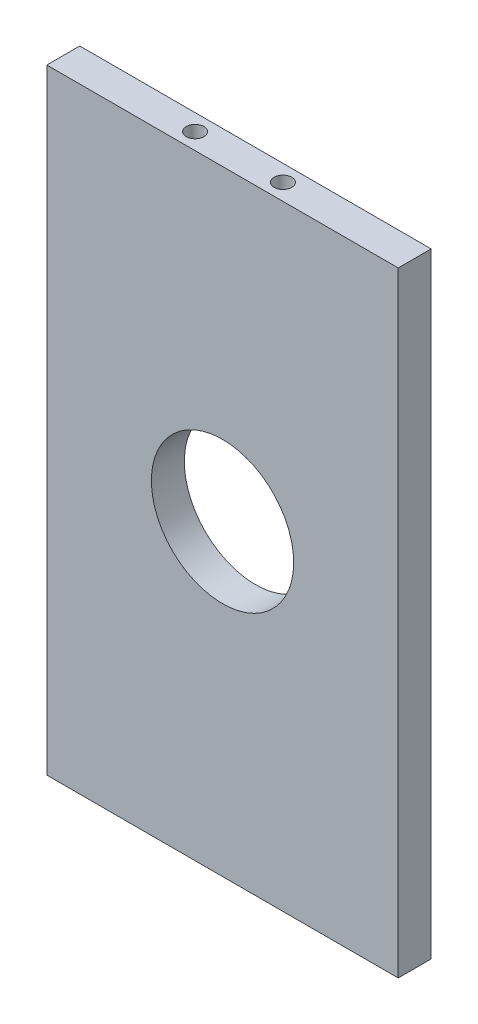
ISO-10303-21;
HEADER;
FILE_DESCRIPTION(('STEP AP214'),'2;1');
FILE_NAME('part.step','',(''),(''),'','','');
FILE_SCHEMA(('AUTOMOTIVE_DESIGN { 1 0 10303 214 1 1 1 1 }'));
ENDSEC;
DATA;
#1=APPLICATION_CONTEXT('core data for automotive mechanical design processes');
#2=APPLICATION_PROTOCOL_DEFINITION('international standard','automotive_design',2000,#1);
#3=PRODUCT_CONTEXT('',#1,'mechanical');
#4=PRODUCT('Part','Part','',(#3));
#5=PRODUCT_RELATED_PRODUCT_CATEGORY('part','',(#4));
#6=PRODUCT_DEFINITION_FORMATION('','',#4);
#7=PRODUCT_DEFINITION_CONTEXT('part definition',#1,'design');
#8=PRODUCT_DEFINITION('design','',#6,#7);
#9=PRODUCT_DEFINITION_SHAPE('','',#8);
#10=(LENGTH_UNIT() NAMED_UNIT(*) SI_UNIT(.MILLI.,.METRE.));
#11=(NAMED_UNIT(*) PLANE_ANGLE_UNIT() SI_UNIT($,.RADIAN.));
#12=(NAMED_UNIT(*) SI_UNIT($,.STERADIAN.) SOLID_ANGLE_UNIT());
#13=UNCERTAINTY_MEASURE_WITH_UNIT(LENGTH_MEASURE(1.E-05),#10,'distance_accuracy_value','');
#14=(GEOMETRIC_REPRESENTATION_CONTEXT(3) GLOBAL_UNCERTAINTY_ASSIGNED_CONTEXT((#13)) GLOBAL_UNIT_ASSIGNED_CONTEXT((#10,
#11,#12)) REPRESENTATION_CONTEXT('',''));
#15=CARTESIAN_POINT('',(0.,0.,0.));
#16=DIRECTION('',(0.,0.,1.));
#17=DIRECTION('',(1.,0.,0.));
#18=AXIS2_PLACEMENT_3D('',#15,#16,#17);
#19=CARTESIAN_POINT('',(0.,0.,9.525));
#20=DIRECTION('',(0.,0.,1.));
#21=DIRECTION('',(1.,0.,0.));
#22=AXIS2_PLACEMENT_3D('',#19,#20,#21);
#23=PLANE('',#22);
#24=DIRECTION('',(0.,1.,0.));
#25=VECTOR('',#24,1.);
#26=CARTESIAN_POINT('',(-50.8,88.9,9.525));
#27=LINE('',#26,#25);
#28=CARTESIAN_POINT('',(-50.8,-88.9,9.525));
#29=VERTEX_POINT('',#28);
#30=CARTESIAN_POINT('',(-50.8,88.9,9.525));
#31=VERTEX_POINT('',#30);
#32=EDGE_CURVE('E93',#29,#31,#27,.T.);
#33=ORIENTED_EDGE('',*,*,#32,.F.);
#34=DIRECTION('',(-1.,0.,0.));
#35=VECTOR('',#34,1.);
#36=CARTESIAN_POINT('',(-101.6,-88.9,9.525));
#37=LINE('',#36,#35);
#38=CARTESIAN_POINT('',(50.8,-88.9,9.525));
#39=VERTEX_POINT('',#38);
#40=EDGE_CURVE('E105',#39,#29,#37,.T.);
#41=ORIENTED_EDGE('',*,*,#40,.F.);
#42=DIRECTION('',(0.,-1.,0.));
#43=VECTOR('',#42,1.);
#44=CARTESIAN_POINT('',(50.8,88.9,9.525));
#45=LINE('',#44,#43);
#46=CARTESIAN_POINT('',(50.8,88.9,9.525));
#47=VERTEX_POINT('',#46);
#48=EDGE_CURVE('E55',#47,#39,#45,.T.);
#49=ORIENTED_EDGE('',*,*,#48,.F.);
#50=DIRECTION('',(1.,0.,0.));
#51=VECTOR('',#50,1.);
#52=CARTESIAN_POINT('',(-101.6,88.9,9.525));
#53=LINE('',#52,#51);
#54=EDGE_CURVE('E107',#31,#47,#53,.T.);
#55=ORIENTED_EDGE('',*,*,#54,.F.);
#56=EDGE_LOOP('',(#33,#41,#49,#55));
#57=FACE_BOUND('',#56,.T.);
#58=CARTESIAN_POINT('',(0.,0.,9.525));
#59=DIRECTION('',(0.,0.,1.));
#60=DIRECTION('',(1.,0.,0.));
#61=AXIS2_PLACEMENT_3D('',#58,#59,#60);
#62=CIRCLE('',#61,20.574);
#63=CARTESIAN_POINT('',(20.574,0.,9.525));
#64=VERTEX_POINT('',#63);
#65=EDGE_CURVE('E48',#64,#64,#62,.T.);
#66=ORIENTED_EDGE('',*,*,#65,.F.);
#67=EDGE_LOOP('',(#66));
#68=FACE_BOUND('',#67,.T.);
#69=ADVANCED_FACE('F40',(#57,#68),#23,.T.);
#70=CARTESIAN_POINT('',(0.,0.,0.));
#71=DIRECTION('',(0.,0.,1.));
#72=DIRECTION('',(1.,0.,0.));
#73=AXIS2_PLACEMENT_3D('',#70,#71,#72);
#74=PLANE('',#73);
#75=CARTESIAN_POINT('',(0.,0.,0.));
#76=DIRECTION('',(0.,0.,1.));
#77=DIRECTION('',(1.,0.,0.));
#78=AXIS2_PLACEMENT_3D('',#75,#76,#77);
#79=CIRCLE('',#78,20.574);
#80=CARTESIAN_POINT('',(20.574,0.,0.));
#81=VERTEX_POINT('',#80);
#82=EDGE_CURVE('E11',#81,#81,#79,.F.);
#83=ORIENTED_EDGE('',*,*,#82,.F.);
#84=EDGE_LOOP('',(#83));
#85=FACE_BOUND('',#84,.T.);
#86=DIRECTION('',(1.,0.,0.));
#87=VECTOR('',#86,1.);
#88=CARTESIAN_POINT('',(-101.6,-88.9,0.));
#89=LINE('',#88,#87);
#90=CARTESIAN_POINT('',(-50.8,-88.9,0.));
#91=VERTEX_POINT('',#90);
#92=CARTESIAN_POINT('',(50.8,-88.9,0.));
#93=VERTEX_POINT('',#92);
#94=EDGE_CURVE('E111',#91,#93,#89,.T.);
#95=ORIENTED_EDGE('',*,*,#94,.F.);
#96=DIRECTION('',(0.,-1.,0.));
#97=VECTOR('',#96,1.);
#98=CARTESIAN_POINT('',(-50.8,88.9,0.));
#99=LINE('',#98,#97);
#100=CARTESIAN_POINT('',(-50.8,88.9,0.));
#101=VERTEX_POINT('',#100);
#102=EDGE_CURVE('E63',#101,#91,#99,.T.);
#103=ORIENTED_EDGE('',*,*,#102,.F.);
#104=DIRECTION('',(-1.,0.,0.));
#105=VECTOR('',#104,1.);
#106=CARTESIAN_POINT('',(-101.6,88.9,0.));
#107=LINE('',#106,#105);
#108=CARTESIAN_POINT('',(50.8,88.9,0.));
#109=VERTEX_POINT('',#108);
#110=EDGE_CURVE('E114',#109,#101,#107,.T.);
#111=ORIENTED_EDGE('',*,*,#110,.F.);
#112=DIRECTION('',(0.,1.,0.));
#113=VECTOR('',#112,1.);
#114=CARTESIAN_POINT('',(50.8,88.9,0.));
#115=LINE('',#114,#113);
#116=EDGE_CURVE('E128',#93,#109,#115,.T.);
#117=ORIENTED_EDGE('',*,*,#116,.F.);
#118=EDGE_LOOP('',(#95,#103,#111,#117));
#119=FACE_BOUND('',#118,.T.);
#120=ADVANCED_FACE('F42',(#85,#119),#74,.F.);
#121=CARTESIAN_POINT('',(0.,0.,-0.000999999999999265));
#122=DIRECTION('',(0.,0.,1.));
#123=DIRECTION('',(1.,0.,0.));
#124=AXIS2_PLACEMENT_3D('',#121,#122,#123);
#125=CYLINDRICAL_SURFACE('',#124,20.574);
#126=ORIENTED_EDGE('',*,*,#65,.T.);
#127=EDGE_LOOP('',(#126));
#128=FACE_BOUND('',#127,.T.);
#129=ORIENTED_EDGE('',*,*,#82,.T.);
#130=EDGE_LOOP('',(#129));
#131=FACE_BOUND('',#130,.T.);
#132=ADVANCED_FACE('F169',(#128,#131),#125,.F.);
#133=CARTESIAN_POINT('',(-101.6,88.9,-0.000999999999999265));
#134=DIRECTION('',(0.,-1.,0.));
#135=DIRECTION('',(1.,0.,0.));
#136=AXIS2_PLACEMENT_3D('',#133,#134,#135);
#137=PLANE('',#136);
#138=CARTESIAN_POINT('',(-12.7,88.9,4.7625));
#139=DIRECTION('',(0.,1.,0.));
#140=DIRECTION('',(0.,0.,1.));
#141=AXIS2_PLACEMENT_3D('',#138,#139,#140);
#142=CIRCLE('',#141,2.55269999999999);
#143=CARTESIAN_POINT('',(-12.7,88.9,7.31519999999999));
#144=VERTEX_POINT('',#143);
#145=EDGE_CURVE('E148',#144,#144,#142,.T.);
#146=ORIENTED_EDGE('',*,*,#145,.F.);
#147=EDGE_LOOP('',(#146));
#148=FACE_BOUND('',#147,.T.);
#149=CARTESIAN_POINT('',(12.7,88.9,4.7625));
#150=DIRECTION('',(0.,1.,0.));
#151=DIRECTION('',(0.,0.,1.));
#152=AXIS2_PLACEMENT_3D('',#149,#150,#151);
#153=CIRCLE('',#152,2.55269999999999);
#154=CARTESIAN_POINT('',(12.7,88.9,7.31519999999999));
#155=VERTEX_POINT('',#154);
#156=EDGE_CURVE('E154',#155,#155,#153,.T.);
#157=ORIENTED_EDGE('',*,*,#156,.F.);
#158=EDGE_LOOP('',(#157));
#159=FACE_BOUND('',#158,.T.);
#160=ORIENTED_EDGE('',*,*,#110,.T.);
#161=DIRECTION('',(0.,0.,1.));
#162=VECTOR('',#161,1.);
#163=CARTESIAN_POINT('',(-50.8,88.9,-0.000999999999999265));
#164=LINE('',#163,#162);
#165=EDGE_CURVE('E99',#101,#31,#164,.T.);
#166=ORIENTED_EDGE('',*,*,#165,.T.);
#167=ORIENTED_EDGE('',*,*,#54,.T.);
#168=DIRECTION('',(0.,0.,1.));
#169=VECTOR('',#168,1.);
#170=CARTESIAN_POINT('',(50.8,88.9,-0.000999999999999265));
#171=LINE('',#170,#169);
#172=EDGE_CURVE('E125',#109,#47,#171,.T.);
#173=ORIENTED_EDGE('',*,*,#172,.F.);
#174=EDGE_LOOP('',(#160,#166,#167,#173));
#175=FACE_BOUND('',#174,.T.);
#176=ADVANCED_FACE('F124',(#148,#159,#175),#137,.F.);
#177=CARTESIAN_POINT('',(-101.6,-88.9,-0.000999999999999265));
#178=DIRECTION('',(0.,1.,0.));
#179=DIRECTION('',(0.,0.,1.));
#180=AXIS2_PLACEMENT_3D('',#177,#178,#179);
#181=PLANE('',#180);
#182=CARTESIAN_POINT('',(-12.7,-88.9,4.7625));
#183=DIRECTION('',(0.,-1.,0.));
#184=DIRECTION('',(0.,0.,-1.));
#185=AXIS2_PLACEMENT_3D('',#182,#183,#184);
#186=CIRCLE('',#185,2.55269999999999);
#187=CARTESIAN_POINT('',(-12.7,-88.9,2.20980000000001));
#188=VERTEX_POINT('',#187);
#189=EDGE_CURVE('E132',#188,#188,#186,.T.);
#190=ORIENTED_EDGE('',*,*,#189,.F.);
#191=EDGE_LOOP('',(#190));
#192=FACE_BOUND('',#191,.T.);
#193=CARTESIAN_POINT('',(12.7,-88.9,4.7625));
#194=DIRECTION('',(0.,-1.,0.));
#195=DIRECTION('',(0.,0.,-1.));
#196=AXIS2_PLACEMENT_3D('',#193,#194,#195);
#197=CIRCLE('',#196,2.55269999999999);
#198=CARTESIAN_POINT('',(12.7,-88.9,2.20980000000001));
#199=VERTEX_POINT('',#198);
#200=EDGE_CURVE('E142',#199,#199,#197,.T.);
#201=ORIENTED_EDGE('',*,*,#200,.F.);
#202=EDGE_LOOP('',(#201));
#203=FACE_BOUND('',#202,.T.);
#204=ORIENTED_EDGE('',*,*,#40,.T.);
#205=DIRECTION('',(0.,0.,1.));
#206=VECTOR('',#205,1.);
#207=CARTESIAN_POINT('',(-50.8,-88.9,-0.000999999999999265));
#208=LINE('',#207,#206);
#209=EDGE_CURVE('E90',#91,#29,#208,.T.);
#210=ORIENTED_EDGE('',*,*,#209,.F.);
#211=ORIENTED_EDGE('',*,*,#94,.T.);
#212=DIRECTION('',(0.,0.,1.));
#213=VECTOR('',#212,1.);
#214=CARTESIAN_POINT('',(50.8,-88.9,-0.000999999999999265));
#215=LINE('',#214,#213);
#216=EDGE_CURVE('E110',#93,#39,#215,.T.);
#217=ORIENTED_EDGE('',*,*,#216,.T.);
#218=EDGE_LOOP('',(#204,#210,#211,#217));
#219=FACE_BOUND('',#218,.T.);
#220=ADVANCED_FACE('F109',(#192,#203,#219),#181,.F.);
#221=CARTESIAN_POINT('',(12.7,69.85,4.7625));
#222=DIRECTION('',(0.,1.,0.));
#223=DIRECTION('',(0.,0.,1.));
#224=AXIS2_PLACEMENT_3D('',#221,#222,#223);
#225=CONICAL_SURFACE('',#224,2.5527,1.02974425867665);
#226=CARTESIAN_POINT('',(12.7,68.3161830978083,4.7625));
#227=VERTEX_POINT('',#226);
#228=VERTEX_LOOP('',#227);
#229=FACE_BOUND('',#228,.T.);
#230=CARTESIAN_POINT('',(12.7,69.85,4.7625));
#231=DIRECTION('',(0.,1.,0.));
#232=DIRECTION('',(0.,0.,1.));
#233=AXIS2_PLACEMENT_3D('',#230,#231,#232);
#234=CIRCLE('',#233,2.5527);
#235=CARTESIAN_POINT('',(12.7,69.85,7.3152));
#236=VERTEX_POINT('',#235);
#237=EDGE_CURVE('E119',#236,#236,#234,.T.);
#238=ORIENTED_EDGE('',*,*,#237,.T.);
#239=EDGE_LOOP('',(#238));
#240=FACE_BOUND('',#239,.T.);
#241=ADVANCED_FACE('F159',(#229,#240),#225,.F.);
#242=CARTESIAN_POINT('',(12.7,88.9,4.7625));
#243=DIRECTION('',(0.,1.,0.));
#244=DIRECTION('',(0.,0.,1.));
#245=AXIS2_PLACEMENT_3D('',#242,#243,#244);
#246=CYLINDRICAL_SURFACE('',#245,2.55269999999999);
#247=ORIENTED_EDGE('',*,*,#237,.F.);
#248=EDGE_LOOP('',(#247));
#249=FACE_BOUND('',#248,.T.);
#250=ORIENTED_EDGE('',*,*,#156,.T.);
#251=EDGE_LOOP('',(#250));
#252=FACE_BOUND('',#251,.T.);
#253=ADVANCED_FACE('F161',(#249,#252),#246,.F.);
#254=CARTESIAN_POINT('',(-12.7,69.85,4.7625));
#255=DIRECTION('',(0.,1.,0.));
#256=DIRECTION('',(0.,0.,1.));
#257=AXIS2_PLACEMENT_3D('',#254,#255,#256);
#258=CONICAL_SURFACE('',#257,2.5527,1.02974425867665);
#259=CARTESIAN_POINT('',(-12.7,68.3161830978083,4.7625));
#260=VERTEX_POINT('',#259);
#261=VERTEX_LOOP('',#260);
#262=FACE_BOUND('',#261,.T.);
#263=CARTESIAN_POINT('',(-12.7,69.85,4.7625));
#264=DIRECTION('',(0.,1.,0.));
#265=DIRECTION('',(0.,0.,1.));
#266=AXIS2_PLACEMENT_3D('',#263,#264,#265);
#267=CIRCLE('',#266,2.5527);
#268=CARTESIAN_POINT('',(-12.7,69.85,7.3152));
#269=VERTEX_POINT('',#268);
#270=EDGE_CURVE('E151',#269,#269,#267,.T.);
#271=ORIENTED_EDGE('',*,*,#270,.T.);
#272=EDGE_LOOP('',(#271));
#273=FACE_BOUND('',#272,.T.);
#274=ADVANCED_FACE('F164',(#262,#273),#258,.F.);
#275=CARTESIAN_POINT('',(-12.7,88.9,4.7625));
#276=DIRECTION('',(0.,1.,0.));
#277=DIRECTION('',(0.,0.,1.));
#278=AXIS2_PLACEMENT_3D('',#275,#276,#277);
#279=CYLINDRICAL_SURFACE('',#278,2.55269999999999);
#280=ORIENTED_EDGE('',*,*,#270,.F.);
#281=EDGE_LOOP('',(#280));
#282=FACE_BOUND('',#281,.T.);
#283=ORIENTED_EDGE('',*,*,#145,.T.);
#284=EDGE_LOOP('',(#283));
#285=FACE_BOUND('',#284,.T.);
#286=ADVANCED_FACE('F241',(#282,#285),#279,.F.);
#287=CARTESIAN_POINT('',(12.7,-69.85,4.7625));
#288=DIRECTION('',(0.,-1.,0.));
#289=DIRECTION('',(0.,0.,-1.));
#290=AXIS2_PLACEMENT_3D('',#287,#288,#289);
#291=CONICAL_SURFACE('',#290,2.5527,1.02974425867665);
#292=CARTESIAN_POINT('',(12.7,-68.3161830978083,4.7625));
#293=VERTEX_POINT('',#292);
#294=VERTEX_LOOP('',#293);
#295=FACE_BOUND('',#294,.T.);
#296=CARTESIAN_POINT('',(12.7,-69.85,4.7625));
#297=DIRECTION('',(0.,-1.,0.));
#298=DIRECTION('',(0.,0.,-1.));
#299=AXIS2_PLACEMENT_3D('',#296,#297,#298);
#300=CIRCLE('',#299,2.5527);
#301=CARTESIAN_POINT('',(12.7,-69.85,2.2098));
#302=VERTEX_POINT('',#301);
#303=EDGE_CURVE('E145',#302,#302,#300,.T.);
#304=ORIENTED_EDGE('',*,*,#303,.T.);
#305=EDGE_LOOP('',(#304));
#306=FACE_BOUND('',#305,.T.);
#307=ADVANCED_FACE('F237',(#295,#306),#291,.F.);
#308=CARTESIAN_POINT('',(12.7,-88.9,4.7625));
#309=DIRECTION('',(0.,-1.,0.));
#310=DIRECTION('',(0.,0.,-1.));
#311=AXIS2_PLACEMENT_3D('',#308,#309,#310);
#312=CYLINDRICAL_SURFACE('',#311,2.55269999999999);
#313=ORIENTED_EDGE('',*,*,#303,.F.);
#314=EDGE_LOOP('',(#313));
#315=FACE_BOUND('',#314,.T.);
#316=ORIENTED_EDGE('',*,*,#200,.T.);
#317=EDGE_LOOP('',(#316));
#318=FACE_BOUND('',#317,.T.);
#319=ADVANCED_FACE('F233',(#315,#318),#312,.F.);
#320=CARTESIAN_POINT('',(-12.7,-69.85,4.7625));
#321=DIRECTION('',(0.,-1.,0.));
#322=DIRECTION('',(0.,0.,-1.));
#323=AXIS2_PLACEMENT_3D('',#320,#321,#322);
#324=CONICAL_SURFACE('',#323,2.5527,1.02974425867665);
#325=CARTESIAN_POINT('',(-12.7,-68.3161830978083,4.7625));
#326=VERTEX_POINT('',#325);
#327=VERTEX_LOOP('',#326);
#328=FACE_BOUND('',#327,.T.);
#329=CARTESIAN_POINT('',(-12.7,-69.85,4.7625));
#330=DIRECTION('',(0.,-1.,0.));
#331=DIRECTION('',(0.,0.,-1.));
#332=AXIS2_PLACEMENT_3D('',#329,#330,#331);
#333=CIRCLE('',#332,2.5527);
#334=CARTESIAN_POINT('',(-12.7,-69.85,2.2098));
#335=VERTEX_POINT('',#334);
#336=EDGE_CURVE('E139',#335,#335,#333,.T.);
#337=ORIENTED_EDGE('',*,*,#336,.T.);
#338=EDGE_LOOP('',(#337));
#339=FACE_BOUND('',#338,.T.);
#340=ADVANCED_FACE('F229',(#328,#339),#324,.F.);
#341=CARTESIAN_POINT('',(-12.7,-88.9,4.7625));
#342=DIRECTION('',(0.,-1.,0.));
#343=DIRECTION('',(0.,0.,-1.));
#344=AXIS2_PLACEMENT_3D('',#341,#342,#343);
#345=CYLINDRICAL_SURFACE('',#344,2.55269999999999);
#346=ORIENTED_EDGE('',*,*,#336,.F.);
#347=EDGE_LOOP('',(#346));
#348=FACE_BOUND('',#347,.T.);
#349=ORIENTED_EDGE('',*,*,#189,.T.);
#350=EDGE_LOOP('',(#349));
#351=FACE_BOUND('',#350,.T.);
#352=ADVANCED_FACE('F213',(#348,#351),#345,.F.);
#353=CARTESIAN_POINT('',(50.8,88.9,-0.000999999999999265));
#354=DIRECTION('',(-1.,0.,0.));
#355=DIRECTION('',(0.,-1.,0.));
#356=AXIS2_PLACEMENT_3D('',#353,#354,#355);
#357=PLANE('',#356);
#358=ORIENTED_EDGE('',*,*,#116,.T.);
#359=ORIENTED_EDGE('',*,*,#172,.T.);
#360=ORIENTED_EDGE('',*,*,#48,.T.);
#361=ORIENTED_EDGE('',*,*,#216,.F.);
#362=EDGE_LOOP('',(#358,#359,#360,#361));
#363=FACE_BOUND('',#362,.T.);
#364=ADVANCED_FACE('F208',(#363),#357,.F.);
#365=CARTESIAN_POINT('',(-50.8,88.9,-0.000999999999999265));
#366=DIRECTION('',(1.,0.,0.));
#367=DIRECTION('',(0.,1.,0.));
#368=AXIS2_PLACEMENT_3D('',#365,#366,#367);
#369=PLANE('',#368);
#370=ORIENTED_EDGE('',*,*,#102,.T.);
#371=ORIENTED_EDGE('',*,*,#209,.T.);
#372=ORIENTED_EDGE('',*,*,#32,.T.);
#373=ORIENTED_EDGE('',*,*,#165,.F.);
#374=EDGE_LOOP('',(#370,#371,#372,#373));
#375=FACE_BOUND('',#374,.T.);
#376=ADVANCED_FACE('F92',(#375),#369,.F.);
#377=CLOSED_SHELL('',(#69,#120,#132,#176,#220,#241,#253,#274,#286,#307,#319,#340,#352,#364,#376));
#378=MANIFOLD_SOLID_BREP('B2',#377);
#379=ADVANCED_BREP_SHAPE_REPRESENTATION('',(#18,#378),#14);
#380=SHAPE_DEFINITION_REPRESENTATION(#9,#379);
ENDSEC;
END-ISO-10303-21;
